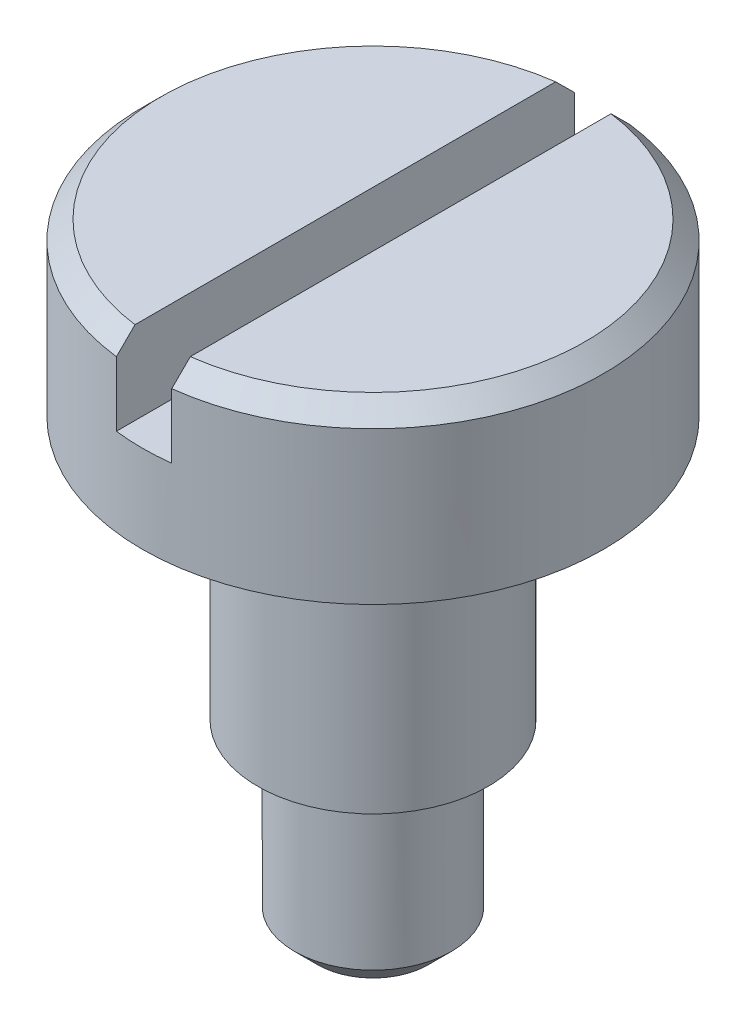
ISO-10303-21;
HEADER;
FILE_DESCRIPTION(('STEP AP214'),'2;1');
FILE_NAME('part.step','',(''),(''),'','','');
FILE_SCHEMA(('AUTOMOTIVE_DESIGN { 1 0 10303 214 1 1 1 1 }'));
ENDSEC;
DATA;
#1=APPLICATION_CONTEXT('core data for automotive mechanical design processes');
#2=APPLICATION_PROTOCOL_DEFINITION('international standard','automotive_design',2000,#1);
#3=PRODUCT_CONTEXT('',#1,'mechanical');
#4=PRODUCT('Part','Part','',(#3));
#5=PRODUCT_RELATED_PRODUCT_CATEGORY('part','',(#4));
#6=PRODUCT_DEFINITION_FORMATION('','',#4);
#7=PRODUCT_DEFINITION_CONTEXT('part definition',#1,'design');
#8=PRODUCT_DEFINITION('design','',#6,#7);
#9=PRODUCT_DEFINITION_SHAPE('','',#8);
#10=(LENGTH_UNIT() NAMED_UNIT(*) SI_UNIT(.MILLI.,.METRE.));
#11=(NAMED_UNIT(*) PLANE_ANGLE_UNIT() SI_UNIT($,.RADIAN.));
#12=(NAMED_UNIT(*) SI_UNIT($,.STERADIAN.) SOLID_ANGLE_UNIT());
#13=UNCERTAINTY_MEASURE_WITH_UNIT(LENGTH_MEASURE(1.E-05),#10,'distance_accuracy_value','');
#14=(GEOMETRIC_REPRESENTATION_CONTEXT(3) GLOBAL_UNCERTAINTY_ASSIGNED_CONTEXT((#13)) GLOBAL_UNIT_ASSIGNED_CONTEXT((#10,
#11,#12)) REPRESENTATION_CONTEXT('',''));
#15=CARTESIAN_POINT('',(0.,0.,0.));
#16=DIRECTION('',(0.,0.,1.));
#17=DIRECTION('',(1.,0.,0.));
#18=AXIS2_PLACEMENT_3D('',#15,#16,#17);
#19=CARTESIAN_POINT('',(0.,6.7,0.));
#20=DIRECTION('',(0.,1.,0.));
#21=DIRECTION('',(0.,0.,1.));
#22=AXIS2_PLACEMENT_3D('',#19,#20,#21);
#23=PLANE('',#22);
#24=DIRECTION('',(0.,0.,1.));
#25=VECTOR('',#24,1.);
#26=CARTESIAN_POINT('',(-0.3,6.7,-2.5));
#27=LINE('',#26,#25);
#28=CARTESIAN_POINT('',(-0.3,6.7,-2.28035085019828));
#29=VERTEX_POINT('',#28);
#30=CARTESIAN_POINT('',(-0.3,6.7,2.28035085019828));
#31=VERTEX_POINT('',#30);
#32=EDGE_CURVE('E104',#29,#31,#27,.T.);
#33=ORIENTED_EDGE('',*,*,#32,.F.);
#34=CARTESIAN_POINT('',(0.,6.7,0.));
#35=DIRECTION('',(0.,1.,0.));
#36=DIRECTION('',(0.,0.,1.));
#37=AXIS2_PLACEMENT_3D('',#34,#35,#36);
#38=CIRCLE('',#37,2.3);
#39=EDGE_CURVE('E109',#29,#31,#38,.T.);
#40=ORIENTED_EDGE('',*,*,#39,.T.);
#41=EDGE_LOOP('',(#33,#40));
#42=FACE_BOUND('',#41,.T.);
#43=ADVANCED_FACE('F36',(#42),#23,.T.);
#44=CARTESIAN_POINT('',(0.,6.7,0.));
#45=DIRECTION('',(0.,-1.,0.));
#46=DIRECTION('',(0.,0.,-1.));
#47=AXIS2_PLACEMENT_3D('',#44,#45,#46);
#48=CONICAL_SURFACE('',#47,2.3,0.785398163397449);
#49=CARTESIAN_POINT('',(-0.3,3.49740095923277,-5.49441500102172));
#50=CARTESIAN_POINT('',(-0.3,3.68437904184473,-5.30715620001564));
#51=CARTESIAN_POINT('',(-0.3,3.87134497413537,-5.11988525896128));
#52=CARTESIAN_POINT('',(-0.3,4.24523879282245,-4.74530183687046));
#53=CARTESIAN_POINT('',(-0.3,4.4321666788391,-4.55798935545493));
#54=CARTESIAN_POINT('',(-0.3,4.80600752109222,-4.18326864041074));
#55=CARTESIAN_POINT('',(-0.3,4.99292046535317,-3.99586039483432));
#56=CARTESIAN_POINT('',(-0.3,5.36666126046775,-3.62096252581089));
#57=CARTESIAN_POINT('',(-0.3,5.55348911209646,-3.43347290313678));
#58=CARTESIAN_POINT('',(-0.3,5.93259363628316,-3.05275236081743));
#59=CARTESIAN_POINT('',(-0.3,6.12486622374014,-2.85951737380285));
#60=CARTESIAN_POINT('',(-0.3,6.50916973886682,-2.47279638791687));
#61=CARTESIAN_POINT('',(-0.3,6.70120065974709,-2.27931038229033));
#62=CARTESIAN_POINT('',(-0.3,6.98883994321344,-1.98870504849486));
#63=CARTESIAN_POINT('',(-0.3,7.08464520469283,-1.89178063812496));
#64=CARTESIAN_POINT('',(-0.3,7.2760484612754,-1.69772498146762));
#65=CARTESIAN_POINT('',(-0.3,7.3716464541014,-1.60059373293074));
#66=CARTESIAN_POINT('',(-0.3,7.56248499619252,-1.40599070199035));
#67=CARTESIAN_POINT('',(-0.3,7.65772556354288,-1.30851893731182));
#68=CARTESIAN_POINT('',(-0.3,7.8475700351555,-1.11295789524718));
#69=CARTESIAN_POINT('',(-0.3,7.94217395453813,-1.01486863263448));
#70=CARTESIAN_POINT('',(-0.3,8.06135458075425,-0.889449161834405));
#71=CARTESIAN_POINT('',(-0.3,8.08660989895674,-0.862765153019541));
#72=CARTESIAN_POINT('',(-0.3,8.13697244199038,-0.809257484328843));
#73=CARTESIAN_POINT('',(-0.3,8.16207966464868,-0.782433822414863));
#74=CARTESIAN_POINT('',(-0.3,8.23697387926633,-0.701863728148212));
#75=CARTESIAN_POINT('',(-0.3,8.28648621187903,-0.647858293090638));
#76=CARTESIAN_POINT('',(-0.3,8.36791155472844,-0.55659925920069));
#77=CARTESIAN_POINT('',(-0.3,8.4002319010554,-0.519709452316788));
#78=CARTESIAN_POINT('',(-0.3,8.46391254944531,-0.444742714247727));
#79=CARTESIAN_POINT('',(-0.3,8.49526667156229,-0.406660416311502));
#80=CARTESIAN_POINT('',(-0.3,8.54073883723581,-0.347953844083806));
#81=CARTESIAN_POINT('',(-0.3,8.55571817198022,-0.328001395001935));
#82=CARTESIAN_POINT('',(-0.3,8.58476156349011,-0.287445666051435));
#83=CARTESIAN_POINT('',(-0.3,8.59882603484562,-0.266842687361308));
#84=CARTESIAN_POINT('',(-0.3,8.62543261767438,-0.224863157128301));
#85=CARTESIAN_POINT('',(-0.3,8.6379846957021,-0.203493029495873));
#86=CARTESIAN_POINT('',(-0.3,8.66072805776845,-0.159554908096857));
#87=CARTESIAN_POINT('',(-0.3,8.67092658182345,-0.13699085767192));
#88=CARTESIAN_POINT('',(-0.3,8.68546935898964,-0.0959344492746688));
#89=CARTESIAN_POINT('',(-0.3,8.69062790945145,-0.0777424058236855));
#90=CARTESIAN_POINT('',(-0.3,8.69777730964675,-0.0407827119720146));
#91=CARTESIAN_POINT('',(-0.3,8.69978090316367,-0.0220176909914338));
#92=CARTESIAN_POINT('',(-0.3,8.70018518531182,0.0156381589663874));
#93=CARTESIAN_POINT('',(-0.3,8.6985696883187,0.0345291748905424));
#94=CARTESIAN_POINT('',(-0.3,8.69208591362269,0.0717752076342206));
#95=CARTESIAN_POINT('',(-0.3,8.68720601879649,0.0901280649380028));
#96=CARTESIAN_POINT('',(-0.3,8.67470643947542,0.127028226162946));
#97=CARTESIAN_POINT('',(-0.3,8.66694415511521,0.145524972778849));
#98=CARTESIAN_POINT('',(-0.3,8.64963631889314,0.181678712199913));
#99=CARTESIAN_POINT('',(-0.3,8.64008739297465,0.199334035500835));
#100=CARTESIAN_POINT('',(-0.3,8.61974330234294,0.234083326816711));
#101=CARTESIAN_POINT('',(-0.3,8.60893902906366,0.251171865837647));
#102=CARTESIAN_POINT('',(-0.3,8.58653780503082,0.28479224562154));
#103=CARTESIAN_POINT('',(-0.3,8.57494157785009,0.301324574485331));
#104=CARTESIAN_POINT('',(-0.3,8.53712591947314,0.353359098089127));
#105=CARTESIAN_POINT('',(-0.3,8.50987442444216,0.388105482828248));
#106=CARTESIAN_POINT('',(-0.3,8.4540641554594,0.456538378601001));
#107=CARTESIAN_POINT('',(-0.3,8.42550457413641,0.490224212802764));
#108=CARTESIAN_POINT('',(-0.3,8.36757227673619,0.556992808389135));
#109=CARTESIAN_POINT('',(-0.3,8.33819821555706,0.590074401537634));
#110=CARTESIAN_POINT('',(-0.3,8.27898135488323,0.65579571299571));
#111=CARTESIAN_POINT('',(-0.3,8.24913868876631,0.688435552286678));
#112=CARTESIAN_POINT('',(-0.3,8.15933430051511,0.785715993452223));
#113=CARTESIAN_POINT('',(-0.3,8.09890916030533,0.849928070452521));
#114=CARTESIAN_POINT('',(-0.3,7.97750059498292,0.977693187892755));
#115=CARTESIAN_POINT('',(-0.3,7.91651780282345,1.04124683423659));
#116=CARTESIAN_POINT('',(-0.3,7.73356110975403,1.2308517311696));
#117=CARTESIAN_POINT('',(-0.3,7.61106147849989,1.35639527890478));
#118=CARTESIAN_POINT('',(-0.3,7.36548846923433,1.6069221557674));
#119=CARTESIAN_POINT('',(-0.3,7.24241507865409,1.73190547250363));
#120=CARTESIAN_POINT('',(-0.3,6.9959046371281,1.98161557427296));
#121=CARTESIAN_POINT('',(-0.3,6.87246745659262,2.10634223150332));
#122=CARTESIAN_POINT('',(-0.3,6.62541415244908,2.35561585955636));
#123=CARTESIAN_POINT('',(-0.3,6.5017980303684,2.48016283189483));
#124=CARTESIAN_POINT('',(-0.3,6.13075740493485,2.8536615007864));
#125=CARTESIAN_POINT('',(-0.3,5.88316497133436,3.10244637086134));
#126=CARTESIAN_POINT('',(-0.3,5.38780211847215,3.5997834009693));
#127=CARTESIAN_POINT('',(-0.3,5.14003172214028,3.84833558386133));
#128=CARTESIAN_POINT('',(-0.3,4.77600091553271,4.21334065594416));
#129=CARTESIAN_POINT('',(-0.3,4.65978679977968,4.32983970942582));
#130=CARTESIAN_POINT('',(-0.3,4.42733473190355,4.56282033079932));
#131=CARTESIAN_POINT('',(-0.3,4.31109677921989,4.67930189813183));
#132=CARTESIAN_POINT('',(-0.3,4.07862187134336,4.91223122439401));
#133=CARTESIAN_POINT('',(-0.3,3.96238491860602,5.02867898577443));
#134=CARTESIAN_POINT('',(-0.3,3.7299007150748,5.26155791420399));
#135=CARTESIAN_POINT('',(-0.3,3.61365346464633,5.3779890816179));
#136=CARTESIAN_POINT('',(-0.3,3.49740095923277,5.49441500102172));
#137=B_SPLINE_CURVE_WITH_KNOTS('',3,(#49,#50,#51,#52,#53,#54,#55,#56,#57,#58,#59,#60,#61,#62,
#63,#64,#65,#66,#67,#68,#69,#70,#71,#72,#73,#74,#75,#76,#77,#78,#79,#80,#81,#82,#83,#84,#85,#86,
#87,#88,#89,#90,#91,#92,#93,#94,#95,#96,#97,#98,#99,#100,#101,#102,#103,#104,#105,#106,#107,
#108,#109,#110,#111,#112,#113,#114,#115,#116,#117,#118,#119,#120,#121,#122,#123,#124,#125,#126,
#127,#128,#129,#130,#131,#132,#133,#134,#135,#136),.UNSPECIFIED.,.F.,.F.,(4,2,2,2,2,2,2,2,2,2,2,
2,2,2,2,2,2,2,2,2,2,2,2,2,2,2,2,2,2,2,2,2,2,2,2,2,2,2,2,2,2,2,2,4),(0.,0.793876546364031,
1.58776066268283,2.38181650155653,3.17586495682467,3.99365253034857,4.81146258775994,
5.22031074168229,5.62916336490971,6.03799501403457,6.44681691890672,6.55703786995822,
6.66726043414782,6.88704208752998,7.03417144534583,7.18210127994141,7.2569344365678,
7.33173344121863,7.40600889829883,7.48005272899999,7.53657161101339,7.5928616058636,
7.64940384825497,7.70614838754923,7.76618693055665,7.82634002164501,7.88696060016449,
7.94752651479469,8.079922895979,8.2124021254584,8.3451149740822,8.47779071011941,
8.7422974836184,9.00653421330329,9.53274606785147,10.0589695043175,10.5854110559238,
11.1118481402548,12.1648260581468,13.2176865404689,13.7113460853179,14.2050190064523,
14.6986180254373,15.1922036393833),.UNSPECIFIED.);
#138=CARTESIAN_POINT('',(-0.3,6.5,-2.48193472919818));
#139=VERTEX_POINT('',#138);
#140=EDGE_CURVE('E181',#139,#29,#137,.T.);
#141=ORIENTED_EDGE('',*,*,#140,.F.);
#142=CARTESIAN_POINT('',(0.,6.5,0.));
#143=DIRECTION('',(0.,1.,0.));
#144=DIRECTION('',(0.,0.,1.));
#145=AXIS2_PLACEMENT_3D('',#142,#143,#144);
#146=CIRCLE('',#145,2.5);
#147=CARTESIAN_POINT('',(-0.3,6.5,2.48193472919817));
#148=VERTEX_POINT('',#147);
#149=EDGE_CURVE('E111',#148,#139,#146,.F.);
#150=ORIENTED_EDGE('',*,*,#149,.F.);
#151=EDGE_CURVE('E97',#31,#148,#137,.T.);
#152=ORIENTED_EDGE('',*,*,#151,.F.);
#153=ORIENTED_EDGE('',*,*,#39,.F.);
#154=EDGE_LOOP('',(#141,#150,#152,#153));
#155=FACE_BOUND('',#154,.T.);
#156=ADVANCED_FACE('F156',(#155),#48,.T.);
#157=CARTESIAN_POINT('',(0.,2.,0.));
#158=DIRECTION('',(0.,-1.,0.));
#159=DIRECTION('',(0.,0.,-1.));
#160=AXIS2_PLACEMENT_3D('',#157,#158,#159);
#161=PLANE('',#160);
#162=CARTESIAN_POINT('',(0.,2.,0.));
#163=DIRECTION('',(0.,-1.,0.));
#164=DIRECTION('',(0.,0.,-1.));
#165=AXIS2_PLACEMENT_3D('',#162,#163,#164);
#166=CIRCLE('',#165,0.85);
#167=CARTESIAN_POINT('',(0.,2.,-0.85));
#168=VERTEX_POINT('',#167);
#169=EDGE_CURVE('E114',#168,#168,#166,.T.);
#170=ORIENTED_EDGE('',*,*,#169,.F.);
#171=EDGE_LOOP('',(#170));
#172=FACE_BOUND('',#171,.T.);
#173=CARTESIAN_POINT('',(0.,2.,0.));
#174=DIRECTION('',(0.,-1.,0.));
#175=DIRECTION('',(0.,0.,-1.));
#176=AXIS2_PLACEMENT_3D('',#173,#174,#175);
#177=CIRCLE('',#176,1.25);
#178=CARTESIAN_POINT('',(0.,2.,-1.25));
#179=VERTEX_POINT('',#178);
#180=EDGE_CURVE('E201',#179,#179,#177,.T.);
#181=ORIENTED_EDGE('',*,*,#180,.T.);
#182=EDGE_LOOP('',(#181));
#183=FACE_BOUND('',#182,.T.);
#184=ADVANCED_FACE('F152',(#172,#183),#161,.T.);
#185=CARTESIAN_POINT('',(0.,2.,0.));
#186=DIRECTION('',(0.,-1.,0.));
#187=DIRECTION('',(0.,0.,-1.));
#188=AXIS2_PLACEMENT_3D('',#185,#186,#187);
#189=CYLINDRICAL_SURFACE('',#188,0.85);
#190=CARTESIAN_POINT('',(0.,0.250000000000002,0.));
#191=DIRECTION('',(0.,1.,0.));
#192=DIRECTION('',(0.,0.,1.));
#193=AXIS2_PLACEMENT_3D('',#190,#191,#192);
#194=CIRCLE('',#193,0.85);
#195=CARTESIAN_POINT('',(0.,0.250000000000002,0.85));
#196=VERTEX_POINT('',#195);
#197=EDGE_CURVE('E12',#196,#196,#194,.T.);
#198=ORIENTED_EDGE('',*,*,#197,.T.);
#199=EDGE_LOOP('',(#198));
#200=FACE_BOUND('',#199,.T.);
#201=ORIENTED_EDGE('',*,*,#169,.T.);
#202=EDGE_LOOP('',(#201));
#203=FACE_BOUND('',#202,.T.);
#204=ADVANCED_FACE('F149',(#200,#203),#189,.T.);
#205=CARTESIAN_POINT('',(0.,0.,0.));
#206=DIRECTION('',(0.,1.,0.));
#207=DIRECTION('',(0.,0.,1.));
#208=AXIS2_PLACEMENT_3D('',#205,#206,#207);
#209=PLANE('',#208);
#210=CARTESIAN_POINT('',(0.,0.,0.));
#211=DIRECTION('',(0.,1.,0.));
#212=DIRECTION('',(0.,0.,1.));
#213=AXIS2_PLACEMENT_3D('',#210,#211,#212);
#214=CIRCLE('',#213,0.599999999999999);
#215=CARTESIAN_POINT('',(0.,0.,0.599999999999999));
#216=VERTEX_POINT('',#215);
#217=EDGE_CURVE('E44',#216,#216,#214,.F.);
#218=ORIENTED_EDGE('',*,*,#217,.T.);
#219=EDGE_LOOP('',(#218));
#220=FACE_BOUND('',#219,.T.);
#221=ADVANCED_FACE('F147',(#220),#209,.F.);
#222=CARTESIAN_POINT('',(0.,4.85,0.));
#223=DIRECTION('',(0.,-1.,0.));
#224=DIRECTION('',(0.,0.,-1.));
#225=AXIS2_PLACEMENT_3D('',#222,#223,#224);
#226=PLANE('',#225);
#227=CARTESIAN_POINT('',(0.,4.85,0.));
#228=DIRECTION('',(0.,-1.,0.));
#229=DIRECTION('',(0.,0.,-1.));
#230=AXIS2_PLACEMENT_3D('',#227,#228,#229);
#231=CIRCLE('',#230,1.25);
#232=CARTESIAN_POINT('',(0.,4.85,-1.25));
#233=VERTEX_POINT('',#232);
#234=EDGE_CURVE('E199',#233,#233,#231,.T.);
#235=ORIENTED_EDGE('',*,*,#234,.F.);
#236=EDGE_LOOP('',(#235));
#237=FACE_BOUND('',#236,.T.);
#238=CARTESIAN_POINT('',(0.,4.85,0.));
#239=DIRECTION('',(0.,-1.,0.));
#240=DIRECTION('',(0.,0.,-1.));
#241=AXIS2_PLACEMENT_3D('',#238,#239,#240);
#242=CIRCLE('',#241,2.5);
#243=CARTESIAN_POINT('',(0.,4.85,-2.5));
#244=VERTEX_POINT('',#243);
#245=EDGE_CURVE('E116',#244,#244,#242,.T.);
#246=ORIENTED_EDGE('',*,*,#245,.T.);
#247=EDGE_LOOP('',(#246));
#248=FACE_BOUND('',#247,.T.);
#249=ADVANCED_FACE('F143',(#237,#248),#226,.T.);
#250=CARTESIAN_POINT('',(0.,4.85,0.));
#251=DIRECTION('',(0.,-1.,0.));
#252=DIRECTION('',(0.,0.,-1.));
#253=AXIS2_PLACEMENT_3D('',#250,#251,#252);
#254=CYLINDRICAL_SURFACE('',#253,1.25);
#255=ORIENTED_EDGE('',*,*,#234,.T.);
#256=EDGE_LOOP('',(#255));
#257=FACE_BOUND('',#256,.T.);
#258=ORIENTED_EDGE('',*,*,#180,.F.);
#259=EDGE_LOOP('',(#258));
#260=FACE_BOUND('',#259,.T.);
#261=ADVANCED_FACE('F140',(#257,#260),#254,.T.);
#262=DIRECTION('',(0.,0.,1.));
#263=VECTOR('',#262,1.);
#264=CARTESIAN_POINT('',(0.3,6.7,-2.5));
#265=LINE('',#264,#263);
#266=CARTESIAN_POINT('',(0.3,6.7,-2.28035085019828));
#267=VERTEX_POINT('',#266);
#268=CARTESIAN_POINT('',(0.3,6.7,2.28035085019828));
#269=VERTEX_POINT('',#268);
#270=EDGE_CURVE('E51',#267,#269,#265,.T.);
#271=ORIENTED_EDGE('',*,*,#270,.T.);
#272=EDGE_CURVE('E103',#269,#267,#38,.T.);
#273=ORIENTED_EDGE('',*,*,#272,.T.);
#274=EDGE_LOOP('',(#271,#273));
#275=FACE_BOUND('',#274,.T.);
#276=ADVANCED_FACE('F102',(#275),#23,.T.);
#277=CARTESIAN_POINT('',(0.,6.7,0.));
#278=DIRECTION('',(0.,-1.,0.));
#279=DIRECTION('',(0.,0.,-1.));
#280=AXIS2_PLACEMENT_3D('',#277,#278,#279);
#281=CYLINDRICAL_SURFACE('',#280,2.5);
#282=CARTESIAN_POINT('',(0.,5.8,0.));
#283=DIRECTION('',(0.,-1.,0.));
#284=DIRECTION('',(0.,0.,-1.));
#285=AXIS2_PLACEMENT_3D('',#282,#283,#284);
#286=CIRCLE('',#285,2.5);
#287=CARTESIAN_POINT('',(-0.3,5.8,-2.48193472919817));
#288=VERTEX_POINT('',#287);
#289=CARTESIAN_POINT('',(0.3,5.8,-2.48193472919817));
#290=VERTEX_POINT('',#289);
#291=EDGE_CURVE('E186',#288,#290,#286,.T.);
#292=ORIENTED_EDGE('',*,*,#291,.T.);
#293=DIRECTION('',(0.,-1.,0.));
#294=VECTOR('',#293,1.);
#295=CARTESIAN_POINT('',(0.3,6.7,-2.48193472919817));
#296=LINE('',#295,#294);
#297=CARTESIAN_POINT('',(0.3,6.5,-2.48193472919817));
#298=VERTEX_POINT('',#297);
#299=EDGE_CURVE('E178',#290,#298,#296,.F.);
#300=ORIENTED_EDGE('',*,*,#299,.T.);
#301=CARTESIAN_POINT('',(0.3,6.5,2.48193472919818));
#302=VERTEX_POINT('',#301);
#303=EDGE_CURVE('E108',#298,#302,#146,.F.);
#304=ORIENTED_EDGE('',*,*,#303,.T.);
#305=DIRECTION('',(0.,-1.,0.));
#306=VECTOR('',#305,1.);
#307=CARTESIAN_POINT('',(0.3,6.7,2.48193472919817));
#308=LINE('',#307,#306);
#309=CARTESIAN_POINT('',(0.3,5.8,2.48193472919817));
#310=VERTEX_POINT('',#309);
#311=EDGE_CURVE('E92',#302,#310,#308,.T.);
#312=ORIENTED_EDGE('',*,*,#311,.T.);
#313=CARTESIAN_POINT('',(-0.3,5.8,2.48193472919817));
#314=VERTEX_POINT('',#313);
#315=EDGE_CURVE('E184',#310,#314,#286,.T.);
#316=ORIENTED_EDGE('',*,*,#315,.T.);
#317=DIRECTION('',(0.,-1.,0.));
#318=VECTOR('',#317,1.);
#319=CARTESIAN_POINT('',(-0.3,6.7,2.48193472919817));
#320=LINE('',#319,#318);
#321=EDGE_CURVE('E207',#314,#148,#320,.F.);
#322=ORIENTED_EDGE('',*,*,#321,.T.);
#323=ORIENTED_EDGE('',*,*,#149,.T.);
#324=DIRECTION('',(0.,-1.,0.));
#325=VECTOR('',#324,1.);
#326=CARTESIAN_POINT('',(-0.3,6.7,-2.48193472919817));
#327=LINE('',#326,#325);
#328=EDGE_CURVE('E59',#139,#288,#327,.T.);
#329=ORIENTED_EDGE('',*,*,#328,.T.);
#330=EDGE_LOOP('',(#292,#300,#304,#312,#316,#322,#323,#329));
#331=FACE_BOUND('',#330,.T.);
#332=ORIENTED_EDGE('',*,*,#245,.F.);
#333=EDGE_LOOP('',(#332));
#334=FACE_BOUND('',#333,.T.);
#335=ADVANCED_FACE('F160',(#331,#334),#281,.T.);
#336=CARTESIAN_POINT('',(0.3,3.49740095923277,5.49441500102172));
#337=CARTESIAN_POINT('',(0.3,3.68437904184473,5.30715620001564));
#338=CARTESIAN_POINT('',(0.3,3.87134497413537,5.11988525896128));
#339=CARTESIAN_POINT('',(0.3,4.24523879282245,4.74530183687046));
#340=CARTESIAN_POINT('',(0.3,4.4321666788391,4.55798935545493));
#341=CARTESIAN_POINT('',(0.3,4.80600752109222,4.18326864041074));
#342=CARTESIAN_POINT('',(0.3,4.99292046535317,3.99586039483432));
#343=CARTESIAN_POINT('',(0.3,5.36666126046775,3.62096252581089));
#344=CARTESIAN_POINT('',(0.3,5.55348911209646,3.43347290313678));
#345=CARTESIAN_POINT('',(0.3,5.93259363628316,3.05275236081743));
#346=CARTESIAN_POINT('',(0.3,6.12486622374014,2.85951737380285));
#347=CARTESIAN_POINT('',(0.3,6.50916973886682,2.47279638791687));
#348=CARTESIAN_POINT('',(0.3,6.70120065974709,2.27931038229033));
#349=CARTESIAN_POINT('',(0.3,6.98883994321344,1.98870504849486));
#350=CARTESIAN_POINT('',(0.3,7.08464520469283,1.89178063812496));
#351=CARTESIAN_POINT('',(0.3,7.2760484612754,1.69772498146762));
#352=CARTESIAN_POINT('',(0.3,7.3716464541014,1.60059373293074));
#353=CARTESIAN_POINT('',(0.3,7.56248499619252,1.40599070199035));
#354=CARTESIAN_POINT('',(0.3,7.65772556354288,1.30851893731182));
#355=CARTESIAN_POINT('',(0.3,7.8475700351555,1.11295789524718));
#356=CARTESIAN_POINT('',(0.3,7.94217395453813,1.01486863263448));
#357=CARTESIAN_POINT('',(0.3,8.06135458075425,0.889449161834405));
#358=CARTESIAN_POINT('',(0.3,8.08660989895674,0.862765153019541));
#359=CARTESIAN_POINT('',(0.3,8.13697244199038,0.809257484328843));
#360=CARTESIAN_POINT('',(0.3,8.16207966464868,0.782433822414863));
#361=CARTESIAN_POINT('',(0.3,8.23697387926633,0.701863728148212));
#362=CARTESIAN_POINT('',(0.3,8.28648621187903,0.647858293090638));
#363=CARTESIAN_POINT('',(0.3,8.36791155472844,0.55659925920069));
#364=CARTESIAN_POINT('',(0.3,8.4002319010554,0.519709452316788));
#365=CARTESIAN_POINT('',(0.3,8.46391254944531,0.444742714247727));
#366=CARTESIAN_POINT('',(0.3,8.49526667156229,0.406660416311502));
#367=CARTESIAN_POINT('',(0.3,8.54073883723581,0.347953844083806));
#368=CARTESIAN_POINT('',(0.3,8.55571817198022,0.328001395001935));
#369=CARTESIAN_POINT('',(0.3,8.58476156349011,0.287445666051435));
#370=CARTESIAN_POINT('',(0.3,8.59882603484562,0.266842687361308));
#371=CARTESIAN_POINT('',(0.3,8.62543261767438,0.224863157128301));
#372=CARTESIAN_POINT('',(0.3,8.6379846957021,0.203493029495873));
#373=CARTESIAN_POINT('',(0.3,8.66072805776845,0.159554908096857));
#374=CARTESIAN_POINT('',(0.3,8.67092658182345,0.13699085767192));
#375=CARTESIAN_POINT('',(0.3,8.68546935898964,0.0959344492746688));
#376=CARTESIAN_POINT('',(0.3,8.69062790945145,0.0777424058236855));
#377=CARTESIAN_POINT('',(0.3,8.69777730964675,0.0407827119720146));
#378=CARTESIAN_POINT('',(0.3,8.69978090316367,0.0220176909914338));
#379=CARTESIAN_POINT('',(0.3,8.70018518531182,-0.0156381589663874));
#380=CARTESIAN_POINT('',(0.3,8.6985696883187,-0.0345291748905424));
#381=CARTESIAN_POINT('',(0.3,8.69208591362269,-0.0717752076342206));
#382=CARTESIAN_POINT('',(0.3,8.68720601879649,-0.0901280649380028));
#383=CARTESIAN_POINT('',(0.3,8.67470643947542,-0.127028226162946));
#384=CARTESIAN_POINT('',(0.3,8.66694415511521,-0.145524972778849));
#385=CARTESIAN_POINT('',(0.3,8.64963631889314,-0.181678712199913));
#386=CARTESIAN_POINT('',(0.3,8.64008739297465,-0.199334035500835));
#387=CARTESIAN_POINT('',(0.3,8.61974330234294,-0.234083326816711));
#388=CARTESIAN_POINT('',(0.3,8.60893902906366,-0.251171865837647));
#389=CARTESIAN_POINT('',(0.3,8.58653780503082,-0.28479224562154));
#390=CARTESIAN_POINT('',(0.3,8.57494157785009,-0.301324574485331));
#391=CARTESIAN_POINT('',(0.3,8.53712591947314,-0.353359098089127));
#392=CARTESIAN_POINT('',(0.3,8.50987442444216,-0.388105482828248));
#393=CARTESIAN_POINT('',(0.3,8.4540641554594,-0.456538378601001));
#394=CARTESIAN_POINT('',(0.3,8.42550457413641,-0.490224212802764));
#395=CARTESIAN_POINT('',(0.3,8.36757227673619,-0.556992808389135));
#396=CARTESIAN_POINT('',(0.3,8.33819821555706,-0.590074401537634));
#397=CARTESIAN_POINT('',(0.3,8.27898135488323,-0.65579571299571));
#398=CARTESIAN_POINT('',(0.3,8.24913868876631,-0.688435552286678));
#399=CARTESIAN_POINT('',(0.3,8.15933430051511,-0.785715993452223));
#400=CARTESIAN_POINT('',(0.3,8.09890916030533,-0.849928070452521));
#401=CARTESIAN_POINT('',(0.3,7.97750059498292,-0.977693187892755));
#402=CARTESIAN_POINT('',(0.3,7.91651780282345,-1.04124683423659));
#403=CARTESIAN_POINT('',(0.3,7.73356110975403,-1.2308517311696));
#404=CARTESIAN_POINT('',(0.3,7.61106147849989,-1.35639527890478));
#405=CARTESIAN_POINT('',(0.3,7.36548846923433,-1.6069221557674));
#406=CARTESIAN_POINT('',(0.3,7.24241507865409,-1.73190547250363));
#407=CARTESIAN_POINT('',(0.3,6.9959046371281,-1.98161557427296));
#408=CARTESIAN_POINT('',(0.3,6.87246745659262,-2.10634223150332));
#409=CARTESIAN_POINT('',(0.3,6.62541415244908,-2.35561585955636));
#410=CARTESIAN_POINT('',(0.3,6.5017980303684,-2.48016283189483));
#411=CARTESIAN_POINT('',(0.3,6.13075740493485,-2.8536615007864));
#412=CARTESIAN_POINT('',(0.3,5.88316497133436,-3.10244637086134));
#413=CARTESIAN_POINT('',(0.3,5.38780211847215,-3.5997834009693));
#414=CARTESIAN_POINT('',(0.3,5.14003172214028,-3.84833558386133));
#415=CARTESIAN_POINT('',(0.3,4.77600091553271,-4.21334065594416));
#416=CARTESIAN_POINT('',(0.3,4.65978679977968,-4.32983970942582));
#417=CARTESIAN_POINT('',(0.3,4.42733473190355,-4.56282033079932));
#418=CARTESIAN_POINT('',(0.3,4.31109677921989,-4.67930189813183));
#419=CARTESIAN_POINT('',(0.3,4.07862187134336,-4.91223122439401));
#420=CARTESIAN_POINT('',(0.3,3.96238491860602,-5.02867898577443));
#421=CARTESIAN_POINT('',(0.3,3.7299007150748,-5.26155791420399));
#422=CARTESIAN_POINT('',(0.3,3.61365346464633,-5.3779890816179));
#423=CARTESIAN_POINT('',(0.3,3.49740095923277,-5.49441500102172));
#424=B_SPLINE_CURVE_WITH_KNOTS('',3,(#336,#337,#338,#339,#340,#341,#342,#343,#344,#345,#346,
#347,#348,#349,#350,#351,#352,#353,#354,#355,#356,#357,#358,#359,#360,#361,#362,#363,#364,#365,
#366,#367,#368,#369,#370,#371,#372,#373,#374,#375,#376,#377,#378,#379,#380,#381,#382,#383,#384,
#385,#386,#387,#388,#389,#390,#391,#392,#393,#394,#395,#396,#397,#398,#399,#400,#401,#402,#403,
#404,#405,#406,#407,#408,#409,#410,#411,#412,#413,#414,#415,#416,#417,#418,#419,#420,#421,#422,
#423),.UNSPECIFIED.,.F.,.F.,(4,2,2,2,2,2,2,2,2,2,2,2,2,2,2,2,2,2,2,2,2,2,2,2,2,2,2,2,2,2,2,2,2,
2,2,2,2,2,2,2,2,2,2,4),(0.,0.793876546364031,1.58776066268283,2.38181650155653,3.17586495682467,
3.99365253034857,4.81146258775994,5.22031074168229,5.62916336490971,6.03799501403457,
6.44681691890672,6.55703786995822,6.66726043414782,6.88704208752998,7.03417144534583,
7.18210127994141,7.2569344365678,7.33173344121863,7.40600889829883,7.48005272899999,
7.53657161101339,7.5928616058636,7.64940384825497,7.70614838754923,7.76618693055665,
7.82634002164501,7.88696060016449,7.94752651479469,8.079922895979,8.2124021254584,
8.3451149740822,8.47779071011941,8.7422974836184,9.00653421330329,9.53274606785147,
10.0589695043175,10.5854110559238,11.1118481402548,12.1648260581468,13.2176865404689,
13.7113460853179,14.2050190064523,14.6986180254373,15.1922036393833),.UNSPECIFIED.);
#425=EDGE_CURVE('E88',#302,#269,#424,.T.);
#426=ORIENTED_EDGE('',*,*,#425,.F.);
#427=ORIENTED_EDGE('',*,*,#303,.F.);
#428=EDGE_CURVE('E98',#267,#298,#424,.T.);
#429=ORIENTED_EDGE('',*,*,#428,.F.);
#430=ORIENTED_EDGE('',*,*,#272,.F.);
#431=EDGE_LOOP('',(#426,#427,#429,#430));
#432=FACE_BOUND('',#431,.T.);
#433=ADVANCED_FACE('F107',(#432),#48,.T.);
#434=CARTESIAN_POINT('',(-0.3,5.8,-2.5));
#435=DIRECTION('',(0.,-1.,0.));
#436=DIRECTION('',(0.,0.,-1.));
#437=AXIS2_PLACEMENT_3D('',#434,#435,#436);
#438=PLANE('',#437);
#439=DIRECTION('',(0.,0.,1.));
#440=VECTOR('',#439,1.);
#441=CARTESIAN_POINT('',(0.3,5.8,-2.5));
#442=LINE('',#441,#440);
#443=EDGE_CURVE('E105',#290,#310,#442,.T.);
#444=ORIENTED_EDGE('',*,*,#443,.F.);
#445=ORIENTED_EDGE('',*,*,#291,.F.);
#446=DIRECTION('',(0.,0.,1.));
#447=VECTOR('',#446,1.);
#448=CARTESIAN_POINT('',(-0.3,5.8,-2.5));
#449=LINE('',#448,#447);
#450=EDGE_CURVE('E212',#288,#314,#449,.T.);
#451=ORIENTED_EDGE('',*,*,#450,.T.);
#452=ORIENTED_EDGE('',*,*,#315,.F.);
#453=EDGE_LOOP('',(#444,#445,#451,#452));
#454=FACE_BOUND('',#453,.T.);
#455=ADVANCED_FACE('F134',(#454),#438,.F.);
#456=CARTESIAN_POINT('',(-0.3,6.7,-2.5));
#457=DIRECTION('',(-1.,0.,0.));
#458=DIRECTION('',(0.,-1.,0.));
#459=AXIS2_PLACEMENT_3D('',#456,#457,#458);
#460=PLANE('',#459);
#461=ORIENTED_EDGE('',*,*,#140,.T.);
#462=ORIENTED_EDGE('',*,*,#32,.T.);
#463=ORIENTED_EDGE('',*,*,#151,.T.);
#464=ORIENTED_EDGE('',*,*,#321,.F.);
#465=ORIENTED_EDGE('',*,*,#450,.F.);
#466=ORIENTED_EDGE('',*,*,#328,.F.);
#467=EDGE_LOOP('',(#461,#462,#463,#464,#465,#466));
#468=FACE_BOUND('',#467,.T.);
#469=ADVANCED_FACE('F133',(#468),#460,.F.);
#470=CARTESIAN_POINT('',(0.3,6.7,-2.5));
#471=DIRECTION('',(1.,0.,0.));
#472=DIRECTION('',(0.,1.,0.));
#473=AXIS2_PLACEMENT_3D('',#470,#471,#472);
#474=PLANE('',#473);
#475=ORIENTED_EDGE('',*,*,#425,.T.);
#476=ORIENTED_EDGE('',*,*,#270,.F.);
#477=ORIENTED_EDGE('',*,*,#428,.T.);
#478=ORIENTED_EDGE('',*,*,#299,.F.);
#479=ORIENTED_EDGE('',*,*,#443,.T.);
#480=ORIENTED_EDGE('',*,*,#311,.F.);
#481=EDGE_LOOP('',(#475,#476,#477,#478,#479,#480));
#482=FACE_BOUND('',#481,.T.);
#483=ADVANCED_FACE('F89',(#482),#474,.F.);
#484=CARTESIAN_POINT('',(0.,0.,0.));
#485=DIRECTION('',(0.,1.,0.));
#486=DIRECTION('',(0.,0.,1.));
#487=AXIS2_PLACEMENT_3D('',#484,#485,#486);
#488=CONICAL_SURFACE('',#487,0.599999999999999,0.785398163397446);
#489=ORIENTED_EDGE('',*,*,#197,.F.);
#490=EDGE_LOOP('',(#489));
#491=FACE_BOUND('',#490,.T.);
#492=ORIENTED_EDGE('',*,*,#217,.F.);
#493=EDGE_LOOP('',(#492));
#494=FACE_BOUND('',#493,.T.);
#495=ADVANCED_FACE('F38',(#491,#494),#488,.T.);
#496=CLOSED_SHELL('',(#43,#156,#184,#204,#221,#249,#261,#276,#335,#433,#455,#469,#483,#495));
#497=MANIFOLD_SOLID_BREP('B2',#496);
#498=ADVANCED_BREP_SHAPE_REPRESENTATION('',(#18,#497),#14);
#499=SHAPE_DEFINITION_REPRESENTATION(#9,#498);
ENDSEC;
END-ISO-10303-21;
